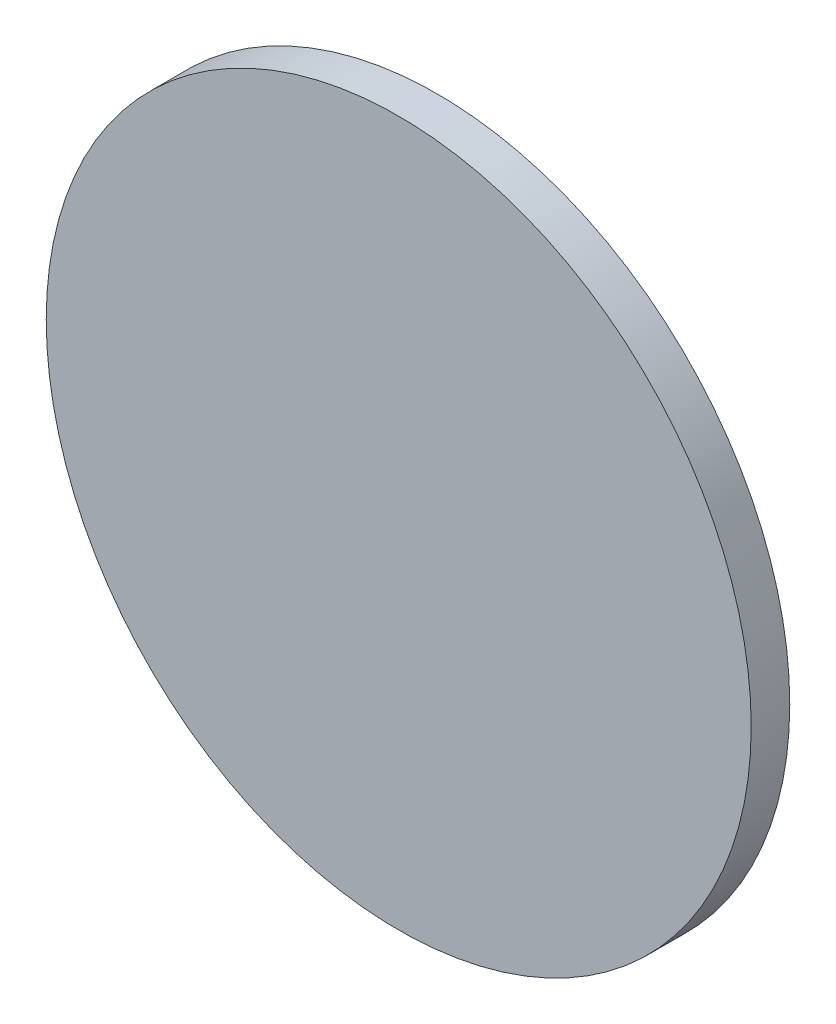
ISO-10303-21;
HEADER;
FILE_DESCRIPTION(('STEP AP214'),'2;1');
FILE_NAME('part.step','',(''),(''),'','','');
FILE_SCHEMA(('AUTOMOTIVE_DESIGN { 1 0 10303 214 1 1 1 1 }'));
ENDSEC;
DATA;
#1=APPLICATION_CONTEXT('core data for automotive mechanical design processes');
#2=APPLICATION_PROTOCOL_DEFINITION('international standard','automotive_design',2000,#1);
#3=PRODUCT_CONTEXT('',#1,'mechanical');
#4=PRODUCT('Part','Part','',(#3));
#5=PRODUCT_RELATED_PRODUCT_CATEGORY('part','',(#4));
#6=PRODUCT_DEFINITION_FORMATION('','',#4);
#7=PRODUCT_DEFINITION_CONTEXT('part definition',#1,'design');
#8=PRODUCT_DEFINITION('design','',#6,#7);
#9=PRODUCT_DEFINITION_SHAPE('','',#8);
#10=(LENGTH_UNIT() NAMED_UNIT(*) SI_UNIT(.MILLI.,.METRE.));
#11=(NAMED_UNIT(*) PLANE_ANGLE_UNIT() SI_UNIT($,.RADIAN.));
#12=(NAMED_UNIT(*) SI_UNIT($,.STERADIAN.) SOLID_ANGLE_UNIT());
#13=UNCERTAINTY_MEASURE_WITH_UNIT(LENGTH_MEASURE(1.E-05),#10,'distance_accuracy_value','');
#14=(GEOMETRIC_REPRESENTATION_CONTEXT(3) GLOBAL_UNCERTAINTY_ASSIGNED_CONTEXT((#13)) GLOBAL_UNIT_ASSIGNED_CONTEXT((#10,
#11,#12)) REPRESENTATION_CONTEXT('',''));
#15=CARTESIAN_POINT('',(0.,0.,0.));
#16=DIRECTION('',(0.,0.,1.));
#17=DIRECTION('',(1.,0.,0.));
#18=AXIS2_PLACEMENT_3D('',#15,#16,#17);
#19=CARTESIAN_POINT('',(0.,0.,7.));
#20=DIRECTION('',(0.,0.,-1.));
#21=DIRECTION('',(-1.,0.,0.));
#22=AXIS2_PLACEMENT_3D('',#19,#20,#21);
#23=CYLINDRICAL_SURFACE('',#22,64.);
#24=CARTESIAN_POINT('',(0.,0.,7.));
#25=DIRECTION('',(0.,0.,1.));
#26=DIRECTION('',(1.,0.,0.));
#27=AXIS2_PLACEMENT_3D('',#24,#25,#26);
#28=CIRCLE('',#27,64.);
#29=CARTESIAN_POINT('',(64.,0.,7.));
#30=VERTEX_POINT('',#29);
#31=EDGE_CURVE('E10',#30,#30,#28,.T.);
#32=ORIENTED_EDGE('',*,*,#31,.F.);
#33=EDGE_LOOP('',(#32));
#34=FACE_BOUND('',#33,.T.);
#35=CARTESIAN_POINT('',(0.,0.,0.));
#36=DIRECTION('',(0.,0.,1.));
#37=DIRECTION('',(1.,0.,0.));
#38=AXIS2_PLACEMENT_3D('',#35,#36,#37);
#39=CIRCLE('',#38,64.);
#40=CARTESIAN_POINT('',(64.,0.,0.));
#41=VERTEX_POINT('',#40);
#42=EDGE_CURVE('E34',#41,#41,#39,.T.);
#43=ORIENTED_EDGE('',*,*,#42,.T.);
#44=EDGE_LOOP('',(#43));
#45=FACE_BOUND('',#44,.T.);
#46=ADVANCED_FACE('F31',(#34,#45),#23,.T.);
#47=CARTESIAN_POINT('',(0.,0.,7.));
#48=DIRECTION('',(0.,0.,1.));
#49=DIRECTION('',(1.,0.,0.));
#50=AXIS2_PLACEMENT_3D('',#47,#48,#49);
#51=PLANE('',#50);
#52=ORIENTED_EDGE('',*,*,#31,.T.);
#53=EDGE_LOOP('',(#52));
#54=FACE_BOUND('',#53,.T.);
#55=ADVANCED_FACE('F46',(#54),#51,.T.);
#56=CARTESIAN_POINT('',(0.,0.,0.));
#57=DIRECTION('',(0.,0.,1.));
#58=DIRECTION('',(1.,0.,0.));
#59=AXIS2_PLACEMENT_3D('',#56,#57,#58);
#60=PLANE('',#59);
#61=ORIENTED_EDGE('',*,*,#42,.F.);
#62=EDGE_LOOP('',(#61));
#63=FACE_BOUND('',#62,.T.);
#64=ADVANCED_FACE('F44',(#63),#60,.F.);
#65=CLOSED_SHELL('',(#46,#55,#64));
#66=MANIFOLD_SOLID_BREP('B2',#65);
#67=ADVANCED_BREP_SHAPE_REPRESENTATION('',(#18,#66),#14);
#68=SHAPE_DEFINITION_REPRESENTATION(#9,#67);
ENDSEC;
END-ISO-10303-21;
